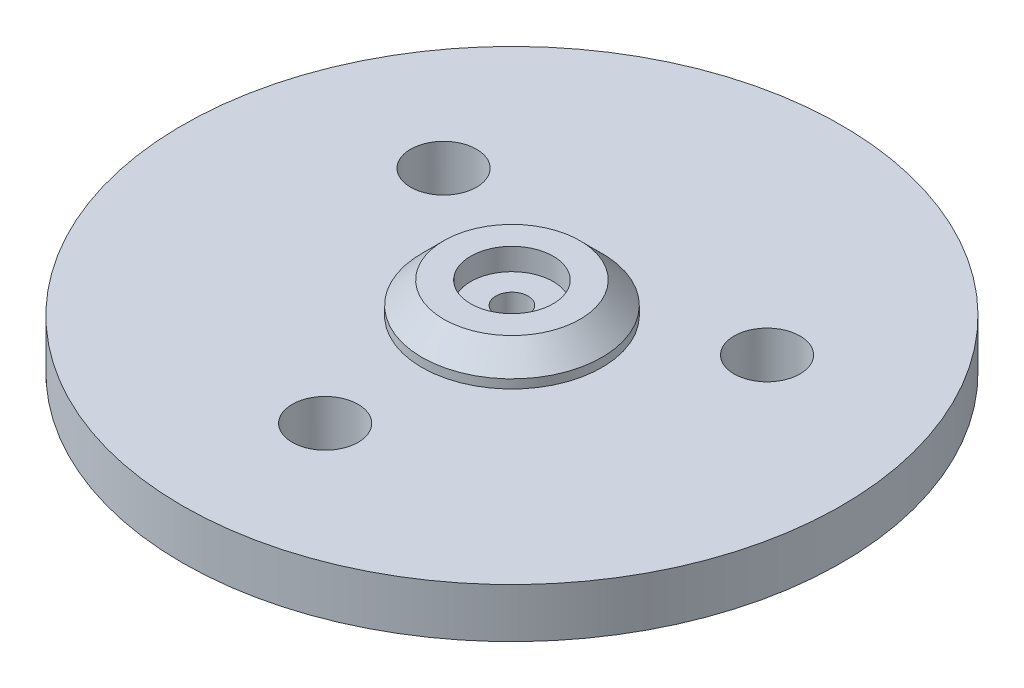
ISO-10303-21;
HEADER;
FILE_DESCRIPTION(('STEP AP214'),'2;1');
FILE_NAME('part.step','',(''),(''),'','','');
FILE_SCHEMA(('AUTOMOTIVE_DESIGN { 1 0 10303 214 1 1 1 1 }'));
ENDSEC;
DATA;
#1=APPLICATION_CONTEXT('core data for automotive mechanical design processes');
#2=APPLICATION_PROTOCOL_DEFINITION('international standard','automotive_design',2000,#1);
#3=PRODUCT_CONTEXT('',#1,'mechanical');
#4=PRODUCT('Part','Part','',(#3));
#5=PRODUCT_RELATED_PRODUCT_CATEGORY('part','',(#4));
#6=PRODUCT_DEFINITION_FORMATION('','',#4);
#7=PRODUCT_DEFINITION_CONTEXT('part definition',#1,'design');
#8=PRODUCT_DEFINITION('design','',#6,#7);
#9=PRODUCT_DEFINITION_SHAPE('','',#8);
#10=(LENGTH_UNIT() NAMED_UNIT(*) SI_UNIT(.MILLI.,.METRE.));
#11=(NAMED_UNIT(*) PLANE_ANGLE_UNIT() SI_UNIT($,.RADIAN.));
#12=(NAMED_UNIT(*) SI_UNIT($,.STERADIAN.) SOLID_ANGLE_UNIT());
#13=UNCERTAINTY_MEASURE_WITH_UNIT(LENGTH_MEASURE(1.E-05),#10,'distance_accuracy_value','');
#14=(GEOMETRIC_REPRESENTATION_CONTEXT(3) GLOBAL_UNCERTAINTY_ASSIGNED_CONTEXT((#13)) GLOBAL_UNIT_ASSIGNED_CONTEXT((#10,
#11,#12)) REPRESENTATION_CONTEXT('',''));
#15=CARTESIAN_POINT('',(0.,0.,0.));
#16=DIRECTION('',(0.,0.,1.));
#17=DIRECTION('',(1.,0.,0.));
#18=AXIS2_PLACEMENT_3D('',#15,#16,#17);
#19=CARTESIAN_POINT('',(0.,0.,0.));
#20=DIRECTION('',(0.,1.,0.));
#21=DIRECTION('',(0.,0.,1.));
#22=AXIS2_PLACEMENT_3D('',#19,#20,#21);
#23=PLANE('',#22);
#24=CARTESIAN_POINT('',(0.,0.,8.5));
#25=DIRECTION('',(0.,-1.,0.));
#26=DIRECTION('',(0.,0.,-1.));
#27=AXIS2_PLACEMENT_3D('',#24,#25,#26);
#28=CIRCLE('',#27,1.5);
#29=CARTESIAN_POINT('',(0.,0.,7.));
#30=VERTEX_POINT('',#29);
#31=EDGE_CURVE('E266',#30,#30,#28,.T.);
#32=ORIENTED_EDGE('',*,*,#31,.F.);
#33=EDGE_LOOP('',(#32));
#34=FACE_BOUND('',#33,.T.);
#35=CARTESIAN_POINT('',(7.36121593216771,0.,-4.25000000000003));
#36=DIRECTION('',(0.,-1.,0.));
#37=DIRECTION('',(0.,0.,-1.));
#38=AXIS2_PLACEMENT_3D('',#35,#36,#37);
#39=CIRCLE('',#38,1.5);
#40=CARTESIAN_POINT('',(7.36121593216771,0.,-5.75000000000003));
#41=VERTEX_POINT('',#40);
#42=EDGE_CURVE('E256',#41,#41,#39,.T.);
#43=ORIENTED_EDGE('',*,*,#42,.F.);
#44=EDGE_LOOP('',(#43));
#45=FACE_BOUND('',#44,.T.);
#46=CARTESIAN_POINT('',(-7.36121593216771,0.,-4.25000000000004));
#47=DIRECTION('',(0.,-1.,0.));
#48=DIRECTION('',(0.,0.,-1.));
#49=AXIS2_PLACEMENT_3D('',#46,#47,#48);
#50=CIRCLE('',#49,1.5);
#51=CARTESIAN_POINT('',(-7.36121593216771,0.,-5.75000000000004));
#52=VERTEX_POINT('',#51);
#53=EDGE_CURVE('E253',#52,#52,#50,.T.);
#54=ORIENTED_EDGE('',*,*,#53,.F.);
#55=EDGE_LOOP('',(#54));
#56=FACE_BOUND('',#55,.T.);
#57=CARTESIAN_POINT('',(0.,0.,0.));
#58=DIRECTION('',(0.,1.,0.));
#59=DIRECTION('',(0.,0.,1.));
#60=AXIS2_PLACEMENT_3D('',#57,#58,#59);
#61=CIRCLE('',#60,15.);
#62=CARTESIAN_POINT('',(0.,0.,15.));
#63=VERTEX_POINT('',#62);
#64=EDGE_CURVE('E233',#63,#63,#61,.T.);
#65=ORIENTED_EDGE('',*,*,#64,.F.);
#66=EDGE_LOOP('',(#65));
#67=FACE_BOUND('',#66,.T.);
#68=CARTESIAN_POINT('',(0.,0.,0.));
#69=DIRECTION('',(0.,1.,0.));
#70=DIRECTION('',(0.,0.,1.));
#71=AXIS2_PLACEMENT_3D('',#68,#69,#70);
#72=CIRCLE('',#71,6.65);
#73=CARTESIAN_POINT('',(0.,0.,6.65));
#74=VERTEX_POINT('',#73);
#75=EDGE_CURVE('E245',#74,#74,#72,.F.);
#76=ORIENTED_EDGE('',*,*,#75,.F.);
#77=EDGE_LOOP('',(#76));
#78=FACE_BOUND('',#77,.T.);
#79=ADVANCED_FACE('F32',(#34,#45,#56,#67,#78),#23,.F.);
#80=CARTESIAN_POINT('',(0.,2.25,0.));
#81=DIRECTION('',(0.,1.,0.));
#82=DIRECTION('',(0.,0.,1.));
#83=AXIS2_PLACEMENT_3D('',#80,#81,#82);
#84=PLANE('',#83);
#85=CARTESIAN_POINT('',(0.,2.25,8.5));
#86=DIRECTION('',(0.,1.,0.));
#87=DIRECTION('',(0.,0.,1.));
#88=AXIS2_PLACEMENT_3D('',#85,#86,#87);
#89=CIRCLE('',#88,1.5);
#90=CARTESIAN_POINT('',(0.,2.25,10.));
#91=VERTEX_POINT('',#90);
#92=EDGE_CURVE('E36',#91,#91,#89,.T.);
#93=ORIENTED_EDGE('',*,*,#92,.F.);
#94=EDGE_LOOP('',(#93));
#95=FACE_BOUND('',#94,.T.);
#96=CARTESIAN_POINT('',(7.36121593216771,2.25,-4.25000000000003));
#97=DIRECTION('',(0.,1.,0.));
#98=DIRECTION('',(0.,0.,1.));
#99=AXIS2_PLACEMENT_3D('',#96,#97,#98);
#100=CIRCLE('',#99,1.5);
#101=CARTESIAN_POINT('',(7.36121593216771,2.25,-2.75000000000004));
#102=VERTEX_POINT('',#101);
#103=EDGE_CURVE('E254',#102,#102,#100,.T.);
#104=ORIENTED_EDGE('',*,*,#103,.F.);
#105=EDGE_LOOP('',(#104));
#106=FACE_BOUND('',#105,.T.);
#107=CARTESIAN_POINT('',(-7.36121593216771,2.25,-4.25000000000004));
#108=DIRECTION('',(0.,1.,0.));
#109=DIRECTION('',(0.,0.,1.));
#110=AXIS2_PLACEMENT_3D('',#107,#108,#109);
#111=CIRCLE('',#110,1.5);
#112=CARTESIAN_POINT('',(-7.36121593216771,2.25,-2.75000000000004));
#113=VERTEX_POINT('',#112);
#114=EDGE_CURVE('E250',#113,#113,#111,.T.);
#115=ORIENTED_EDGE('',*,*,#114,.F.);
#116=EDGE_LOOP('',(#115));
#117=FACE_BOUND('',#116,.T.);
#118=CARTESIAN_POINT('',(0.,2.25,0.));
#119=DIRECTION('',(0.,1.,0.));
#120=DIRECTION('',(0.,0.,1.));
#121=AXIS2_PLACEMENT_3D('',#118,#119,#120);
#122=CIRCLE('',#121,15.);
#123=CARTESIAN_POINT('',(0.,2.25,15.));
#124=VERTEX_POINT('',#123);
#125=EDGE_CURVE('E234',#124,#124,#122,.T.);
#126=ORIENTED_EDGE('',*,*,#125,.T.);
#127=EDGE_LOOP('',(#126));
#128=FACE_BOUND('',#127,.T.);
#129=CARTESIAN_POINT('',(0.,2.25,0.));
#130=DIRECTION('',(0.,1.,0.));
#131=DIRECTION('',(0.,0.,1.));
#132=AXIS2_PLACEMENT_3D('',#129,#130,#131);
#133=CIRCLE('',#132,4.1);
#134=CARTESIAN_POINT('',(0.,2.25,4.1));
#135=VERTEX_POINT('',#134);
#136=EDGE_CURVE('E209',#135,#135,#133,.T.);
#137=ORIENTED_EDGE('',*,*,#136,.F.);
#138=EDGE_LOOP('',(#137));
#139=FACE_BOUND('',#138,.T.);
#140=ADVANCED_FACE('F329',(#95,#106,#117,#128,#139),#84,.T.);
#141=CARTESIAN_POINT('',(0.,2.25,0.));
#142=DIRECTION('',(0.,-1.,0.));
#143=DIRECTION('',(0.,0.,-1.));
#144=AXIS2_PLACEMENT_3D('',#141,#142,#143);
#145=CYLINDRICAL_SURFACE('',#144,15.);
#146=ORIENTED_EDGE('',*,*,#125,.F.);
#147=EDGE_LOOP('',(#146));
#148=FACE_BOUND('',#147,.T.);
#149=ORIENTED_EDGE('',*,*,#64,.T.);
#150=EDGE_LOOP('',(#149));
#151=FACE_BOUND('',#150,.T.);
#152=ADVANCED_FACE('F335',(#148,#151),#145,.T.);
#153=CARTESIAN_POINT('',(0.,3.65,0.));
#154=DIRECTION('',(0.,-1.,0.));
#155=DIRECTION('',(0.,0.,-1.));
#156=AXIS2_PLACEMENT_3D('',#153,#154,#155);
#157=CYLINDRICAL_SURFACE('',#156,4.1);
#158=CARTESIAN_POINT('',(0.,2.65,0.));
#159=DIRECTION('',(0.,1.,0.));
#160=DIRECTION('',(0.,0.,1.));
#161=AXIS2_PLACEMENT_3D('',#158,#159,#160);
#162=CIRCLE('',#161,4.1);
#163=CARTESIAN_POINT('',(0.,2.65,4.1));
#164=VERTEX_POINT('',#163);
#165=EDGE_CURVE('E242',#164,#164,#162,.F.);
#166=ORIENTED_EDGE('',*,*,#165,.T.);
#167=EDGE_LOOP('',(#166));
#168=FACE_BOUND('',#167,.T.);
#169=ORIENTED_EDGE('',*,*,#136,.T.);
#170=EDGE_LOOP('',(#169));
#171=FACE_BOUND('',#170,.T.);
#172=ADVANCED_FACE('F343',(#168,#171),#157,.T.);
#173=CARTESIAN_POINT('',(0.,3.65,0.));
#174=DIRECTION('',(0.,1.,0.));
#175=DIRECTION('',(0.,0.,1.));
#176=AXIS2_PLACEMENT_3D('',#173,#174,#175);
#177=PLANE('',#176);
#178=CARTESIAN_POINT('',(0.,3.65,0.));
#179=DIRECTION('',(0.,1.,0.));
#180=DIRECTION('',(0.,0.,1.));
#181=AXIS2_PLACEMENT_3D('',#178,#179,#180);
#182=CIRCLE('',#181,1.87759173826149);
#183=CARTESIAN_POINT('',(0.,3.65,1.87759173826149));
#184=VERTEX_POINT('',#183);
#185=EDGE_CURVE('E274',#184,#184,#182,.T.);
#186=ORIENTED_EDGE('',*,*,#185,.F.);
#187=EDGE_LOOP('',(#186));
#188=FACE_BOUND('',#187,.T.);
#189=CARTESIAN_POINT('',(0.,3.65,0.));
#190=DIRECTION('',(0.,1.,0.));
#191=DIRECTION('',(0.,0.,1.));
#192=AXIS2_PLACEMENT_3D('',#189,#190,#191);
#193=CIRCLE('',#192,3.1);
#194=CARTESIAN_POINT('',(0.,3.65,3.1));
#195=VERTEX_POINT('',#194);
#196=EDGE_CURVE('E237',#195,#195,#193,.T.);
#197=ORIENTED_EDGE('',*,*,#196,.T.);
#198=EDGE_LOOP('',(#197));
#199=FACE_BOUND('',#198,.T.);
#200=ADVANCED_FACE('F348',(#188,#199),#177,.T.);
#201=CARTESIAN_POINT('',(0.,3.65,0.));
#202=DIRECTION('',(0.,-1.,0.));
#203=DIRECTION('',(0.,0.,-1.));
#204=AXIS2_PLACEMENT_3D('',#201,#202,#203);
#205=CONICAL_SURFACE('',#204,3.1,0.785398163397447);
#206=ORIENTED_EDGE('',*,*,#165,.F.);
#207=EDGE_LOOP('',(#206));
#208=FACE_BOUND('',#207,.T.);
#209=ORIENTED_EDGE('',*,*,#196,.F.);
#210=EDGE_LOOP('',(#209));
#211=FACE_BOUND('',#210,.T.);
#212=ADVANCED_FACE('F345',(#208,#211),#205,.T.);
#213=CARTESIAN_POINT('',(0.,-3.3,0.));
#214=DIRECTION('',(0.,1.,0.));
#215=DIRECTION('',(0.,0.,1.));
#216=AXIS2_PLACEMENT_3D('',#213,#214,#215);
#217=CYLINDRICAL_SURFACE('',#216,6.65);
#218=CARTESIAN_POINT('',(0.,-0.399999999999992,0.));
#219=DIRECTION('',(0.,-1.,0.));
#220=DIRECTION('',(0.,0.,-1.));
#221=AXIS2_PLACEMENT_3D('',#218,#219,#220);
#222=CIRCLE('',#221,6.65);
#223=CARTESIAN_POINT('',(0.,-0.399999999999992,-6.65));
#224=VERTEX_POINT('',#223);
#225=EDGE_CURVE('E11',#224,#224,#222,.F.);
#226=ORIENTED_EDGE('',*,*,#225,.T.);
#227=EDGE_LOOP('',(#226));
#228=FACE_BOUND('',#227,.T.);
#229=ORIENTED_EDGE('',*,*,#75,.T.);
#230=EDGE_LOOP('',(#229));
#231=FACE_BOUND('',#230,.T.);
#232=ADVANCED_FACE('F347',(#228,#231),#217,.T.);
#233=CARTESIAN_POINT('',(0.,-3.3,0.));
#234=DIRECTION('',(0.,-1.,0.));
#235=DIRECTION('',(0.,0.,-1.));
#236=AXIS2_PLACEMENT_3D('',#233,#234,#235);
#237=PLANE('',#236);
#238=DIRECTION('',(-0.546354163801803,0.,-0.837554253583869));
#239=VECTOR('',#238,1.);
#240=CARTESIAN_POINT('',(-1.78213120247556,-3.3,1.84380114157509));
#241=LINE('',#240,#239);
#242=CARTESIAN_POINT('',(-1.78213120247556,-3.3,1.84380114157509));
#243=VERTEX_POINT('',#242);
#244=CARTESIAN_POINT('',(-2.40564006544381,-3.3,0.887969677433934));
#245=VERTEX_POINT('',#244);
#246=EDGE_CURVE('E49',#243,#245,#241,.T.);
#247=ORIENTED_EDGE('',*,*,#246,.F.);
#248=DIRECTION('',(-0.855649263693068,0.,-0.517556120185541));
#249=VECTOR('',#248,1.);
#250=CARTESIAN_POINT('',(-0.80564939845216,-3.3,2.43444517689027));
#251=LINE('',#250,#249);
#252=CARTESIAN_POINT('',(-0.80564939845216,-3.3,2.43444517689027));
#253=VERTEX_POINT('',#252);
#254=EDGE_CURVE('E205',#253,#243,#251,.T.);
#255=ORIENTED_EDGE('',*,*,#254,.F.);
#256=DIRECTION('',(-0.995472533060361,0.,-0.0950496497752017));
#257=VECTOR('',#256,1.);
#258=CARTESIAN_POINT('',(0.330401149576147,-3.3,2.54291748841156));
#259=LINE('',#258,#257);
#260=CARTESIAN_POINT('',(0.330401149576147,-3.3,2.54291748841156));
#261=VERTEX_POINT('',#260);
#262=EDGE_CURVE('E203',#261,#253,#259,.T.);
#263=ORIENTED_EDGE('',*,*,#262,.F.);
#264=DIRECTION('',(-0.938130258585626,0.,0.346282569480571));
#265=VECTOR('',#264,1.);
#266=CARTESIAN_POINT('',(1.40101169782672,-3.3,2.14773380451659));
#267=LINE('',#266,#265);
#268=CARTESIAN_POINT('',(1.40101169782672,-3.3,2.14773380451659));
#269=VERTEX_POINT('',#268);
#270=EDGE_CURVE('E145',#269,#261,#267,.T.);
#271=ORIENTED_EDGE('',*,*,#270,.F.);
#272=DIRECTION('',(-0.694979780985429,0.,0.719029278973704));
#273=VECTOR('',#272,1.);
#274=CARTESIAN_POINT('',(2.19413469704182,-3.3,1.32716510041057));
#275=LINE('',#274,#273);
#276=CARTESIAN_POINT('',(2.19413469704182,-3.3,1.32716510041057));
#277=VERTEX_POINT('',#276);
#278=EDGE_CURVE('E199',#277,#269,#275,.T.);
#279=ORIENTED_EDGE('',*,*,#278,.F.);
#280=DIRECTION('',(-0.314180034393401,0.,0.949363421450691));
#281=VECTOR('',#280,1.);
#282=CARTESIAN_POINT('',(2.55268241021165,-3.3,0.243735071556436));
#283=LINE('',#282,#281);
#284=CARTESIAN_POINT('',(2.55268241021165,-3.3,0.243735071556436));
#285=VERTEX_POINT('',#284);
#286=EDGE_CURVE('E196',#285,#277,#283,.T.);
#287=ORIENTED_EDGE('',*,*,#286,.F.);
#288=DIRECTION('',(0.128846921175499,0.,0.991664495131088));
#289=VECTOR('',#288,1.);
#290=CARTESIAN_POINT('',(2.40564006544381,-3.3,-0.887969677433934));
#291=LINE('',#290,#289);
#292=CARTESIAN_POINT('',(2.40564006544381,-3.3,-0.887969677433934));
#293=VERTEX_POINT('',#292);
#294=EDGE_CURVE('E193',#293,#285,#291,.T.);
#295=ORIENTED_EDGE('',*,*,#294,.F.);
#296=DIRECTION('',(0.546354163801803,0.,0.837554253583869));
#297=VECTOR('',#296,1.);
#298=CARTESIAN_POINT('',(1.78213120247556,-3.3,-1.84380114157509));
#299=LINE('',#298,#297);
#300=CARTESIAN_POINT('',(1.78213120247556,-3.3,-1.84380114157509));
#301=VERTEX_POINT('',#300);
#302=EDGE_CURVE('E190',#301,#293,#299,.T.);
#303=ORIENTED_EDGE('',*,*,#302,.F.);
#304=DIRECTION('',(0.855649263693068,0.,0.517556120185541));
#305=VECTOR('',#304,1.);
#306=CARTESIAN_POINT('',(0.805649398452158,-3.3,-2.43444517689027));
#307=LINE('',#306,#305);
#308=CARTESIAN_POINT('',(0.805649398452158,-3.3,-2.43444517689027));
#309=VERTEX_POINT('',#308);
#310=EDGE_CURVE('E187',#309,#301,#307,.T.);
#311=ORIENTED_EDGE('',*,*,#310,.F.);
#312=DIRECTION('',(0.995472533060361,0.,0.0950496497752021));
#313=VECTOR('',#312,1.);
#314=CARTESIAN_POINT('',(-0.330401149576148,-3.3,-2.54291748841156));
#315=LINE('',#314,#313);
#316=CARTESIAN_POINT('',(-0.330401149576148,-3.3,-2.54291748841156));
#317=VERTEX_POINT('',#316);
#318=EDGE_CURVE('E184',#317,#309,#315,.T.);
#319=ORIENTED_EDGE('',*,*,#318,.F.);
#320=DIRECTION('',(0.938130258585626,0.,-0.346282569480572));
#321=VECTOR('',#320,1.);
#322=CARTESIAN_POINT('',(-1.40101169782672,-3.3,-2.14773380451659));
#323=LINE('',#322,#321);
#324=CARTESIAN_POINT('',(-1.40101169782672,-3.3,-2.14773380451659));
#325=VERTEX_POINT('',#324);
#326=EDGE_CURVE('E181',#325,#317,#323,.T.);
#327=ORIENTED_EDGE('',*,*,#326,.F.);
#328=DIRECTION('',(0.694979780985429,0.,-0.719029278973704));
#329=VECTOR('',#328,1.);
#330=CARTESIAN_POINT('',(-2.19413469704182,-3.3,-1.32716510041057));
#331=LINE('',#330,#329);
#332=CARTESIAN_POINT('',(-2.19413469704182,-3.3,-1.32716510041057));
#333=VERTEX_POINT('',#332);
#334=EDGE_CURVE('E178',#333,#325,#331,.T.);
#335=ORIENTED_EDGE('',*,*,#334,.F.);
#336=DIRECTION('',(0.3141800343934,0.,-0.949363421450691));
#337=VECTOR('',#336,1.);
#338=CARTESIAN_POINT('',(-2.55268241021165,-3.3,-0.243735071556438));
#339=LINE('',#338,#337);
#340=CARTESIAN_POINT('',(-2.55268241021165,-3.3,-0.243735071556438));
#341=VERTEX_POINT('',#340);
#342=EDGE_CURVE('E175',#341,#333,#339,.T.);
#343=ORIENTED_EDGE('',*,*,#342,.F.);
#344=DIRECTION('',(-0.128846921175499,0.,-0.991664495131087));
#345=VECTOR('',#344,1.);
#346=CARTESIAN_POINT('',(-2.40564006544381,-3.3,0.887969677433934));
#347=LINE('',#346,#345);
#348=EDGE_CURVE('E171',#245,#341,#347,.T.);
#349=ORIENTED_EDGE('',*,*,#348,.F.);
#350=EDGE_LOOP('',(#247,#255,#263,#271,#279,#287,#295,#303,#311,#319,#327,#335,#343,#349));
#351=FACE_BOUND('',#350,.T.);
#352=CARTESIAN_POINT('',(0.,-3.3,0.));
#353=DIRECTION('',(0.,-1.,0.));
#354=DIRECTION('',(0.,0.,-1.));
#355=AXIS2_PLACEMENT_3D('',#352,#353,#354);
#356=CIRCLE('',#355,3.75);
#357=CARTESIAN_POINT('',(0.,-3.3,-3.75));
#358=VERTEX_POINT('',#357);
#359=EDGE_CURVE('E41',#358,#358,#356,.T.);
#360=ORIENTED_EDGE('',*,*,#359,.T.);
#361=EDGE_LOOP('',(#360));
#362=FACE_BOUND('',#361,.T.);
#363=ADVANCED_FACE('F312',(#351,#362),#237,.T.);
#364=CARTESIAN_POINT('',(0.,-3.3,0.));
#365=DIRECTION('',(0.,1.,0.));
#366=DIRECTION('',(0.,0.,1.));
#367=AXIS2_PLACEMENT_3D('',#364,#365,#366);
#368=CONICAL_SURFACE('',#367,3.75,0.785398163397448);
#369=ORIENTED_EDGE('',*,*,#225,.F.);
#370=EDGE_LOOP('',(#369));
#371=FACE_BOUND('',#370,.T.);
#372=ORIENTED_EDGE('',*,*,#359,.F.);
#373=EDGE_LOOP('',(#372));
#374=FACE_BOUND('',#373,.T.);
#375=ADVANCED_FACE('F34',(#371,#374),#368,.T.);
#376=CARTESIAN_POINT('',(-1.78213120247556,-0.3,1.84380114157509));
#377=DIRECTION('',(-0.837554253583869,0.,0.546354163801803));
#378=DIRECTION('',(0.546354163801803,0.,0.837554253583869));
#379=AXIS2_PLACEMENT_3D('',#376,#377,#378);
#380=PLANE('',#379);
#381=ORIENTED_EDGE('',*,*,#246,.T.);
#382=DIRECTION('',(0.,-1.,0.));
#383=VECTOR('',#382,1.);
#384=CARTESIAN_POINT('',(-2.40564006544381,-0.3,0.887969677433934));
#385=LINE('',#384,#383);
#386=CARTESIAN_POINT('',(-2.40564006544381,-0.3,0.887969677433934));
#387=VERTEX_POINT('',#386);
#388=EDGE_CURVE('E103',#387,#245,#385,.T.);
#389=ORIENTED_EDGE('',*,*,#388,.F.);
#390=DIRECTION('',(-0.546354163801803,0.,-0.837554253583869));
#391=VECTOR('',#390,1.);
#392=CARTESIAN_POINT('',(-1.78213120247556,-0.3,1.84380114157509));
#393=LINE('',#392,#391);
#394=CARTESIAN_POINT('',(-1.78213120247556,-0.3,1.84380114157509));
#395=VERTEX_POINT('',#394);
#396=EDGE_CURVE('E207',#395,#387,#393,.T.);
#397=ORIENTED_EDGE('',*,*,#396,.F.);
#398=DIRECTION('',(0.,-1.,0.));
#399=VECTOR('',#398,1.);
#400=CARTESIAN_POINT('',(-1.78213120247556,-0.3,1.84380114157509));
#401=LINE('',#400,#399);
#402=EDGE_CURVE('E57',#395,#243,#401,.T.);
#403=ORIENTED_EDGE('',*,*,#402,.T.);
#404=EDGE_LOOP('',(#381,#389,#397,#403));
#405=FACE_BOUND('',#404,.T.);
#406=ADVANCED_FACE('F317',(#405),#380,.F.);
#407=CARTESIAN_POINT('',(-0.80564939845216,-0.3,2.43444517689027));
#408=DIRECTION('',(-0.517556120185541,0.,0.855649263693068));
#409=DIRECTION('',(0.855649263693068,0.,0.517556120185541));
#410=AXIS2_PLACEMENT_3D('',#407,#408,#409);
#411=PLANE('',#410);
#412=ORIENTED_EDGE('',*,*,#254,.T.);
#413=ORIENTED_EDGE('',*,*,#402,.F.);
#414=DIRECTION('',(-0.855649263693068,0.,-0.517556120185541));
#415=VECTOR('',#414,1.);
#416=CARTESIAN_POINT('',(-0.80564939845216,-0.3,2.43444517689027));
#417=LINE('',#416,#415);
#418=CARTESIAN_POINT('',(-0.80564939845216,-0.3,2.43444517689027));
#419=VERTEX_POINT('',#418);
#420=EDGE_CURVE('E157',#419,#395,#417,.T.);
#421=ORIENTED_EDGE('',*,*,#420,.F.);
#422=DIRECTION('',(0.,-1.,0.));
#423=VECTOR('',#422,1.);
#424=CARTESIAN_POINT('',(-0.80564939845216,-0.3,2.43444517689027));
#425=LINE('',#424,#423);
#426=EDGE_CURVE('E149',#419,#253,#425,.T.);
#427=ORIENTED_EDGE('',*,*,#426,.T.);
#428=EDGE_LOOP('',(#412,#413,#421,#427));
#429=FACE_BOUND('',#428,.T.);
#430=ADVANCED_FACE('F316',(#429),#411,.F.);
#431=CARTESIAN_POINT('',(0.330401149576147,-0.3,2.54291748841156));
#432=DIRECTION('',(-0.0950496497752017,0.,0.995472533060361));
#433=DIRECTION('',(0.995472533060361,0.,0.0950496497752017));
#434=AXIS2_PLACEMENT_3D('',#431,#432,#433);
#435=PLANE('',#434);
#436=ORIENTED_EDGE('',*,*,#262,.T.);
#437=ORIENTED_EDGE('',*,*,#426,.F.);
#438=DIRECTION('',(-0.995472533060361,0.,-0.0950496497752017));
#439=VECTOR('',#438,1.);
#440=CARTESIAN_POINT('',(0.330401149576147,-0.3,2.54291748841156));
#441=LINE('',#440,#439);
#442=CARTESIAN_POINT('',(0.330401149576147,-0.3,2.54291748841156));
#443=VERTEX_POINT('',#442);
#444=EDGE_CURVE('E153',#443,#419,#441,.T.);
#445=ORIENTED_EDGE('',*,*,#444,.F.);
#446=DIRECTION('',(0.,-1.,0.));
#447=VECTOR('',#446,1.);
#448=CARTESIAN_POINT('',(0.330401149576147,-0.3,2.54291748841156));
#449=LINE('',#448,#447);
#450=EDGE_CURVE('E138',#443,#261,#449,.T.);
#451=ORIENTED_EDGE('',*,*,#450,.T.);
#452=EDGE_LOOP('',(#436,#437,#445,#451));
#453=FACE_BOUND('',#452,.T.);
#454=ADVANCED_FACE('F154',(#453),#435,.F.);
#455=CARTESIAN_POINT('',(1.40101169782672,-0.3,2.14773380451659));
#456=DIRECTION('',(0.346282569480571,0.,0.938130258585626));
#457=DIRECTION('',(0.938130258585626,0.,-0.346282569480571));
#458=AXIS2_PLACEMENT_3D('',#455,#456,#457);
#459=PLANE('',#458);
#460=ORIENTED_EDGE('',*,*,#270,.T.);
#461=ORIENTED_EDGE('',*,*,#450,.F.);
#462=DIRECTION('',(-0.938130258585626,0.,0.346282569480571));
#463=VECTOR('',#462,1.);
#464=CARTESIAN_POINT('',(1.40101169782672,-0.3,2.14773380451659));
#465=LINE('',#464,#463);
#466=CARTESIAN_POINT('',(1.40101169782672,-0.3,2.14773380451659));
#467=VERTEX_POINT('',#466);
#468=EDGE_CURVE('E142',#467,#443,#465,.T.);
#469=ORIENTED_EDGE('',*,*,#468,.F.);
#470=DIRECTION('',(0.,-1.,0.));
#471=VECTOR('',#470,1.);
#472=CARTESIAN_POINT('',(1.40101169782672,-0.3,2.14773380451659));
#473=LINE('',#472,#471);
#474=EDGE_CURVE('E150',#467,#269,#473,.T.);
#475=ORIENTED_EDGE('',*,*,#474,.T.);
#476=EDGE_LOOP('',(#460,#461,#469,#475));
#477=FACE_BOUND('',#476,.T.);
#478=ADVANCED_FACE('F140',(#477),#459,.F.);
#479=CARTESIAN_POINT('',(2.19413469704182,-0.3,1.32716510041057));
#480=DIRECTION('',(0.719029278973704,0.,0.694979780985429));
#481=DIRECTION('',(0.694979780985429,0.,-0.719029278973704));
#482=AXIS2_PLACEMENT_3D('',#479,#480,#481);
#483=PLANE('',#482);
#484=ORIENTED_EDGE('',*,*,#278,.T.);
#485=ORIENTED_EDGE('',*,*,#474,.F.);
#486=DIRECTION('',(-0.694979780985429,0.,0.719029278973704));
#487=VECTOR('',#486,1.);
#488=CARTESIAN_POINT('',(2.19413469704182,-0.3,1.32716510041057));
#489=LINE('',#488,#487);
#490=CARTESIAN_POINT('',(2.19413469704182,-0.3,1.32716510041057));
#491=VERTEX_POINT('',#490);
#492=EDGE_CURVE('E163',#491,#467,#489,.T.);
#493=ORIENTED_EDGE('',*,*,#492,.F.);
#494=DIRECTION('',(0.,-1.,0.));
#495=VECTOR('',#494,1.);
#496=CARTESIAN_POINT('',(2.19413469704182,-0.3,1.32716510041057));
#497=LINE('',#496,#495);
#498=EDGE_CURVE('E212',#491,#277,#497,.T.);
#499=ORIENTED_EDGE('',*,*,#498,.T.);
#500=EDGE_LOOP('',(#484,#485,#493,#499));
#501=FACE_BOUND('',#500,.T.);
#502=ADVANCED_FACE('F310',(#501),#483,.F.);
#503=CARTESIAN_POINT('',(2.55268241021165,-0.3,0.243735071556436));
#504=DIRECTION('',(0.949363421450691,0.,0.314180034393401));
#505=DIRECTION('',(0.314180034393401,0.,-0.949363421450691));
#506=AXIS2_PLACEMENT_3D('',#503,#504,#505);
#507=PLANE('',#506);
#508=ORIENTED_EDGE('',*,*,#286,.T.);
#509=ORIENTED_EDGE('',*,*,#498,.F.);
#510=DIRECTION('',(-0.314180034393401,0.,0.949363421450691));
#511=VECTOR('',#510,1.);
#512=CARTESIAN_POINT('',(2.55268241021165,-0.3,0.243735071556436));
#513=LINE('',#512,#511);
#514=CARTESIAN_POINT('',(2.55268241021165,-0.3,0.243735071556436));
#515=VERTEX_POINT('',#514);
#516=EDGE_CURVE('E165',#515,#491,#513,.T.);
#517=ORIENTED_EDGE('',*,*,#516,.F.);
#518=DIRECTION('',(0.,-1.,0.));
#519=VECTOR('',#518,1.);
#520=CARTESIAN_POINT('',(2.55268241021165,-0.3,0.243735071556436));
#521=LINE('',#520,#519);
#522=EDGE_CURVE('E214',#515,#285,#521,.T.);
#523=ORIENTED_EDGE('',*,*,#522,.T.);
#524=EDGE_LOOP('',(#508,#509,#517,#523));
#525=FACE_BOUND('',#524,.T.);
#526=ADVANCED_FACE('F306',(#525),#507,.F.);
#527=CARTESIAN_POINT('',(2.40564006544381,-0.3,-0.887969677433934));
#528=DIRECTION('',(0.991664495131088,0.,-0.128846921175499));
#529=DIRECTION('',(-0.128846921175499,0.,-0.991664495131088));
#530=AXIS2_PLACEMENT_3D('',#527,#528,#529);
#531=PLANE('',#530);
#532=ORIENTED_EDGE('',*,*,#294,.T.);
#533=ORIENTED_EDGE('',*,*,#522,.F.);
#534=DIRECTION('',(0.128846921175499,0.,0.991664495131088));
#535=VECTOR('',#534,1.);
#536=CARTESIAN_POINT('',(2.40564006544381,-0.3,-0.887969677433934));
#537=LINE('',#536,#535);
#538=CARTESIAN_POINT('',(2.40564006544381,-0.3,-0.887969677433934));
#539=VERTEX_POINT('',#538);
#540=EDGE_CURVE('E301',#539,#515,#537,.T.);
#541=ORIENTED_EDGE('',*,*,#540,.F.);
#542=DIRECTION('',(0.,-1.,0.));
#543=VECTOR('',#542,1.);
#544=CARTESIAN_POINT('',(2.40564006544381,-0.3,-0.887969677433934));
#545=LINE('',#544,#543);
#546=EDGE_CURVE('E216',#539,#293,#545,.T.);
#547=ORIENTED_EDGE('',*,*,#546,.T.);
#548=EDGE_LOOP('',(#532,#533,#541,#547));
#549=FACE_BOUND('',#548,.T.);
#550=ADVANCED_FACE('F467',(#549),#531,.F.);
#551=CARTESIAN_POINT('',(1.78213120247556,-0.3,-1.84380114157509));
#552=DIRECTION('',(0.837554253583869,0.,-0.546354163801803));
#553=DIRECTION('',(-0.546354163801803,0.,-0.837554253583869));
#554=AXIS2_PLACEMENT_3D('',#551,#552,#553);
#555=PLANE('',#554);
#556=ORIENTED_EDGE('',*,*,#302,.T.);
#557=ORIENTED_EDGE('',*,*,#546,.F.);
#558=DIRECTION('',(0.546354163801803,0.,0.837554253583869));
#559=VECTOR('',#558,1.);
#560=CARTESIAN_POINT('',(1.78213120247556,-0.3,-1.84380114157509));
#561=LINE('',#560,#559);
#562=CARTESIAN_POINT('',(1.78213120247556,-0.3,-1.84380114157509));
#563=VERTEX_POINT('',#562);
#564=EDGE_CURVE('E298',#563,#539,#561,.T.);
#565=ORIENTED_EDGE('',*,*,#564,.F.);
#566=DIRECTION('',(0.,-1.,0.));
#567=VECTOR('',#566,1.);
#568=CARTESIAN_POINT('',(1.78213120247556,-0.3,-1.84380114157509));
#569=LINE('',#568,#567);
#570=EDGE_CURVE('E218',#563,#301,#569,.T.);
#571=ORIENTED_EDGE('',*,*,#570,.T.);
#572=EDGE_LOOP('',(#556,#557,#565,#571));
#573=FACE_BOUND('',#572,.T.);
#574=ADVANCED_FACE('F470',(#573),#555,.F.);
#575=CARTESIAN_POINT('',(0.805649398452158,-0.3,-2.43444517689027));
#576=DIRECTION('',(0.517556120185541,0.,-0.855649263693068));
#577=DIRECTION('',(-0.855649263693068,0.,-0.517556120185541));
#578=AXIS2_PLACEMENT_3D('',#575,#576,#577);
#579=PLANE('',#578);
#580=ORIENTED_EDGE('',*,*,#310,.T.);
#581=ORIENTED_EDGE('',*,*,#570,.F.);
#582=DIRECTION('',(0.855649263693068,0.,0.517556120185541));
#583=VECTOR('',#582,1.);
#584=CARTESIAN_POINT('',(0.805649398452158,-0.3,-2.43444517689027));
#585=LINE('',#584,#583);
#586=CARTESIAN_POINT('',(0.805649398452158,-0.3,-2.43444517689027));
#587=VERTEX_POINT('',#586);
#588=EDGE_CURVE('E295',#587,#563,#585,.T.);
#589=ORIENTED_EDGE('',*,*,#588,.F.);
#590=DIRECTION('',(0.,-1.,0.));
#591=VECTOR('',#590,1.);
#592=CARTESIAN_POINT('',(0.805649398452158,-0.3,-2.43444517689027));
#593=LINE('',#592,#591);
#594=EDGE_CURVE('E220',#587,#309,#593,.T.);
#595=ORIENTED_EDGE('',*,*,#594,.T.);
#596=EDGE_LOOP('',(#580,#581,#589,#595));
#597=FACE_BOUND('',#596,.T.);
#598=ADVANCED_FACE('F474',(#597),#579,.F.);
#599=CARTESIAN_POINT('',(-0.330401149576148,-0.3,-2.54291748841156));
#600=DIRECTION('',(0.0950496497752021,0.,-0.995472533060361));
#601=DIRECTION('',(-0.995472533060361,0.,-0.0950496497752021));
#602=AXIS2_PLACEMENT_3D('',#599,#600,#601);
#603=PLANE('',#602);
#604=ORIENTED_EDGE('',*,*,#318,.T.);
#605=ORIENTED_EDGE('',*,*,#594,.F.);
#606=DIRECTION('',(0.995472533060361,0.,0.0950496497752021));
#607=VECTOR('',#606,1.);
#608=CARTESIAN_POINT('',(-0.330401149576148,-0.3,-2.54291748841156));
#609=LINE('',#608,#607);
#610=CARTESIAN_POINT('',(-0.330401149576148,-0.3,-2.54291748841156));
#611=VERTEX_POINT('',#610);
#612=EDGE_CURVE('E292',#611,#587,#609,.T.);
#613=ORIENTED_EDGE('',*,*,#612,.F.);
#614=DIRECTION('',(0.,-1.,0.));
#615=VECTOR('',#614,1.);
#616=CARTESIAN_POINT('',(-0.330401149576148,-0.3,-2.54291748841156));
#617=LINE('',#616,#615);
#618=EDGE_CURVE('E222',#611,#317,#617,.T.);
#619=ORIENTED_EDGE('',*,*,#618,.T.);
#620=EDGE_LOOP('',(#604,#605,#613,#619));
#621=FACE_BOUND('',#620,.T.);
#622=ADVANCED_FACE('F478',(#621),#603,.F.);
#623=CARTESIAN_POINT('',(-1.40101169782672,-0.3,-2.14773380451659));
#624=DIRECTION('',(-0.346282569480572,0.,-0.938130258585626));
#625=DIRECTION('',(-0.938130258585626,0.,0.346282569480572));
#626=AXIS2_PLACEMENT_3D('',#623,#624,#625);
#627=PLANE('',#626);
#628=ORIENTED_EDGE('',*,*,#326,.T.);
#629=ORIENTED_EDGE('',*,*,#618,.F.);
#630=DIRECTION('',(0.938130258585626,0.,-0.346282569480572));
#631=VECTOR('',#630,1.);
#632=CARTESIAN_POINT('',(-1.40101169782672,-0.3,-2.14773380451659));
#633=LINE('',#632,#631);
#634=CARTESIAN_POINT('',(-1.40101169782672,-0.3,-2.14773380451659));
#635=VERTEX_POINT('',#634);
#636=EDGE_CURVE('E289',#635,#611,#633,.T.);
#637=ORIENTED_EDGE('',*,*,#636,.F.);
#638=DIRECTION('',(0.,-1.,0.));
#639=VECTOR('',#638,1.);
#640=CARTESIAN_POINT('',(-1.40101169782672,-0.3,-2.14773380451659));
#641=LINE('',#640,#639);
#642=EDGE_CURVE('E224',#635,#325,#641,.T.);
#643=ORIENTED_EDGE('',*,*,#642,.T.);
#644=EDGE_LOOP('',(#628,#629,#637,#643));
#645=FACE_BOUND('',#644,.T.);
#646=ADVANCED_FACE('F482',(#645),#627,.F.);
#647=CARTESIAN_POINT('',(-2.19413469704182,-0.3,-1.32716510041057));
#648=DIRECTION('',(-0.719029278973704,0.,-0.694979780985429));
#649=DIRECTION('',(-0.694979780985429,0.,0.719029278973704));
#650=AXIS2_PLACEMENT_3D('',#647,#648,#649);
#651=PLANE('',#650);
#652=ORIENTED_EDGE('',*,*,#334,.T.);
#653=ORIENTED_EDGE('',*,*,#642,.F.);
#654=DIRECTION('',(0.694979780985429,0.,-0.719029278973704));
#655=VECTOR('',#654,1.);
#656=CARTESIAN_POINT('',(-2.19413469704182,-0.3,-1.32716510041057));
#657=LINE('',#656,#655);
#658=CARTESIAN_POINT('',(-2.19413469704182,-0.3,-1.32716510041057));
#659=VERTEX_POINT('',#658);
#660=EDGE_CURVE('E286',#659,#635,#657,.T.);
#661=ORIENTED_EDGE('',*,*,#660,.F.);
#662=DIRECTION('',(0.,-1.,0.));
#663=VECTOR('',#662,1.);
#664=CARTESIAN_POINT('',(-2.19413469704182,-0.3,-1.32716510041057));
#665=LINE('',#664,#663);
#666=EDGE_CURVE('E226',#659,#333,#665,.T.);
#667=ORIENTED_EDGE('',*,*,#666,.T.);
#668=EDGE_LOOP('',(#652,#653,#661,#667));
#669=FACE_BOUND('',#668,.T.);
#670=ADVANCED_FACE('F486',(#669),#651,.F.);
#671=CARTESIAN_POINT('',(-2.55268241021165,-0.3,-0.243735071556438));
#672=DIRECTION('',(-0.949363421450691,0.,-0.3141800343934));
#673=DIRECTION('',(-0.3141800343934,0.,0.949363421450691));
#674=AXIS2_PLACEMENT_3D('',#671,#672,#673);
#675=PLANE('',#674);
#676=ORIENTED_EDGE('',*,*,#342,.T.);
#677=ORIENTED_EDGE('',*,*,#666,.F.);
#678=DIRECTION('',(0.3141800343934,0.,-0.949363421450691));
#679=VECTOR('',#678,1.);
#680=CARTESIAN_POINT('',(-2.55268241021165,-0.3,-0.243735071556438));
#681=LINE('',#680,#679);
#682=CARTESIAN_POINT('',(-2.55268241021165,-0.3,-0.243735071556438));
#683=VERTEX_POINT('',#682);
#684=EDGE_CURVE('E283',#683,#659,#681,.T.);
#685=ORIENTED_EDGE('',*,*,#684,.F.);
#686=DIRECTION('',(0.,-1.,0.));
#687=VECTOR('',#686,1.);
#688=CARTESIAN_POINT('',(-2.55268241021165,-0.3,-0.243735071556438));
#689=LINE('',#688,#687);
#690=EDGE_CURVE('E228',#683,#341,#689,.T.);
#691=ORIENTED_EDGE('',*,*,#690,.T.);
#692=EDGE_LOOP('',(#676,#677,#685,#691));
#693=FACE_BOUND('',#692,.T.);
#694=ADVANCED_FACE('F490',(#693),#675,.F.);
#695=CARTESIAN_POINT('',(-2.40564006544381,-0.3,0.887969677433934));
#696=DIRECTION('',(-0.991664495131088,0.,0.128846921175499));
#697=DIRECTION('',(0.128846921175499,0.,0.991664495131088));
#698=AXIS2_PLACEMENT_3D('',#695,#696,#697);
#699=PLANE('',#698);
#700=ORIENTED_EDGE('',*,*,#348,.T.);
#701=ORIENTED_EDGE('',*,*,#690,.F.);
#702=DIRECTION('',(-0.128846921175499,0.,-0.991664495131087));
#703=VECTOR('',#702,1.);
#704=CARTESIAN_POINT('',(-2.40564006544381,-0.3,0.887969677433934));
#705=LINE('',#704,#703);
#706=EDGE_CURVE('E280',#387,#683,#705,.T.);
#707=ORIENTED_EDGE('',*,*,#706,.F.);
#708=ORIENTED_EDGE('',*,*,#388,.T.);
#709=EDGE_LOOP('',(#700,#701,#707,#708));
#710=FACE_BOUND('',#709,.T.);
#711=ADVANCED_FACE('F456',(#710),#699,.F.);
#712=CARTESIAN_POINT('',(0.,-0.3,0.));
#713=DIRECTION('',(0.,-1.,0.));
#714=DIRECTION('',(0.,0.,-1.));
#715=AXIS2_PLACEMENT_3D('',#712,#713,#714);
#716=PLANE('',#715);
#717=CARTESIAN_POINT('',(0.,-0.3,0.));
#718=DIRECTION('',(0.,-1.,0.));
#719=DIRECTION('',(0.,0.,-1.));
#720=AXIS2_PLACEMENT_3D('',#717,#718,#719);
#721=CIRCLE('',#720,0.734970499575306);
#722=CARTESIAN_POINT('',(0.,-0.3,-0.734970499575306));
#723=VERTEX_POINT('',#722);
#724=EDGE_CURVE('E271',#723,#723,#721,.T.);
#725=ORIENTED_EDGE('',*,*,#724,.F.);
#726=EDGE_LOOP('',(#725));
#727=FACE_BOUND('',#726,.T.);
#728=ORIENTED_EDGE('',*,*,#396,.T.);
#729=ORIENTED_EDGE('',*,*,#706,.T.);
#730=ORIENTED_EDGE('',*,*,#684,.T.);
#731=ORIENTED_EDGE('',*,*,#660,.T.);
#732=ORIENTED_EDGE('',*,*,#636,.T.);
#733=ORIENTED_EDGE('',*,*,#612,.T.);
#734=ORIENTED_EDGE('',*,*,#588,.T.);
#735=ORIENTED_EDGE('',*,*,#564,.T.);
#736=ORIENTED_EDGE('',*,*,#540,.T.);
#737=ORIENTED_EDGE('',*,*,#516,.T.);
#738=ORIENTED_EDGE('',*,*,#492,.T.);
#739=ORIENTED_EDGE('',*,*,#468,.T.);
#740=ORIENTED_EDGE('',*,*,#444,.T.);
#741=ORIENTED_EDGE('',*,*,#420,.T.);
#742=EDGE_LOOP('',(#728,#729,#730,#731,#732,#733,#734,#735,#736,#737,#738,#739,#740,#741));
#743=FACE_BOUND('',#742,.T.);
#744=ADVANCED_FACE('F160',(#727,#743),#716,.T.);
#745=CARTESIAN_POINT('',(0.,2.65,0.));
#746=DIRECTION('',(0.,1.,0.));
#747=DIRECTION('',(0.,0.,1.));
#748=AXIS2_PLACEMENT_3D('',#745,#746,#747);
#749=CYLINDRICAL_SURFACE('',#748,1.87759173826149);
#750=CARTESIAN_POINT('',(0.,2.65,0.));
#751=DIRECTION('',(0.,1.,0.));
#752=DIRECTION('',(0.,0.,1.));
#753=AXIS2_PLACEMENT_3D('',#750,#751,#752);
#754=CIRCLE('',#753,1.87759173826149);
#755=CARTESIAN_POINT('',(0.,2.65,1.87759173826149));
#756=VERTEX_POINT('',#755);
#757=EDGE_CURVE('E172',#756,#756,#754,.T.);
#758=ORIENTED_EDGE('',*,*,#757,.F.);
#759=EDGE_LOOP('',(#758));
#760=FACE_BOUND('',#759,.T.);
#761=ORIENTED_EDGE('',*,*,#185,.T.);
#762=EDGE_LOOP('',(#761));
#763=FACE_BOUND('',#762,.T.);
#764=ADVANCED_FACE('F450',(#760,#763),#749,.F.);
#765=CARTESIAN_POINT('',(0.,2.65,0.));
#766=DIRECTION('',(0.,1.,0.));
#767=DIRECTION('',(0.,0.,1.));
#768=AXIS2_PLACEMENT_3D('',#765,#766,#767);
#769=PLANE('',#768);
#770=CARTESIAN_POINT('',(0.,2.65,0.));
#771=DIRECTION('',(0.,1.,0.));
#772=DIRECTION('',(0.,0.,1.));
#773=AXIS2_PLACEMENT_3D('',#770,#771,#772);
#774=CIRCLE('',#773,0.734970499575306);
#775=CARTESIAN_POINT('',(0.,2.65,0.734970499575306));
#776=VERTEX_POINT('',#775);
#777=EDGE_CURVE('E252',#776,#776,#774,.T.);
#778=ORIENTED_EDGE('',*,*,#777,.F.);
#779=EDGE_LOOP('',(#778));
#780=FACE_BOUND('',#779,.T.);
#781=ORIENTED_EDGE('',*,*,#757,.T.);
#782=EDGE_LOOP('',(#781));
#783=FACE_BOUND('',#782,.T.);
#784=ADVANCED_FACE('F446',(#780,#783),#769,.T.);
#785=CARTESIAN_POINT('',(0.,-7.35,0.));
#786=DIRECTION('',(0.,1.,0.));
#787=DIRECTION('',(0.,0.,1.));
#788=AXIS2_PLACEMENT_3D('',#785,#786,#787);
#789=CYLINDRICAL_SURFACE('',#788,0.734970499575306);
#790=ORIENTED_EDGE('',*,*,#724,.T.);
#791=EDGE_LOOP('',(#790));
#792=FACE_BOUND('',#791,.T.);
#793=ORIENTED_EDGE('',*,*,#777,.T.);
#794=EDGE_LOOP('',(#793));
#795=FACE_BOUND('',#794,.T.);
#796=ADVANCED_FACE('F418',(#792,#795),#789,.F.);
#797=CARTESIAN_POINT('',(-7.36121593216771,10.,-4.25000000000004));
#798=DIRECTION('',(0.,-1.,0.));
#799=DIRECTION('',(0.,0.,-1.));
#800=AXIS2_PLACEMENT_3D('',#797,#798,#799);
#801=CYLINDRICAL_SURFACE('',#800,1.5);
#802=ORIENTED_EDGE('',*,*,#114,.T.);
#803=EDGE_LOOP('',(#802));
#804=FACE_BOUND('',#803,.T.);
#805=ORIENTED_EDGE('',*,*,#53,.T.);
#806=EDGE_LOOP('',(#805));
#807=FACE_BOUND('',#806,.T.);
#808=ADVANCED_FACE('F412',(#804,#807),#801,.F.);
#809=CARTESIAN_POINT('',(7.36121593216771,10.,-4.25000000000003));
#810=DIRECTION('',(0.,-1.,0.));
#811=DIRECTION('',(0.,0.,-1.));
#812=AXIS2_PLACEMENT_3D('',#809,#810,#811);
#813=CYLINDRICAL_SURFACE('',#812,1.5);
#814=ORIENTED_EDGE('',*,*,#103,.T.);
#815=EDGE_LOOP('',(#814));
#816=FACE_BOUND('',#815,.T.);
#817=ORIENTED_EDGE('',*,*,#42,.T.);
#818=EDGE_LOOP('',(#817));
#819=FACE_BOUND('',#818,.T.);
#820=ADVANCED_FACE('F417',(#816,#819),#813,.F.);
#821=CARTESIAN_POINT('',(0.,10.,8.5));
#822=DIRECTION('',(0.,-1.,0.));
#823=DIRECTION('',(0.,0.,-1.));
#824=AXIS2_PLACEMENT_3D('',#821,#822,#823);
#825=CYLINDRICAL_SURFACE('',#824,1.5);
#826=ORIENTED_EDGE('',*,*,#92,.T.);
#827=EDGE_LOOP('',(#826));
#828=FACE_BOUND('',#827,.T.);
#829=ORIENTED_EDGE('',*,*,#31,.T.);
#830=EDGE_LOOP('',(#829));
#831=FACE_BOUND('',#830,.T.);
#832=ADVANCED_FACE('F430',(#828,#831),#825,.F.);
#833=CLOSED_SHELL('',(#79,#140,#152,#172,#200,#212,#232,#363,#375,#406,#430,#454,#478,#502,#526,
#550,#574,#598,#622,#646,#670,#694,#711,#744,#764,#784,#796,#808,#820,#832));
#834=MANIFOLD_SOLID_BREP('B2',#833);
#835=ADVANCED_BREP_SHAPE_REPRESENTATION('',(#18,#834),#14);
#836=SHAPE_DEFINITION_REPRESENTATION(#9,#835);
ENDSEC;
END-ISO-10303-21;
